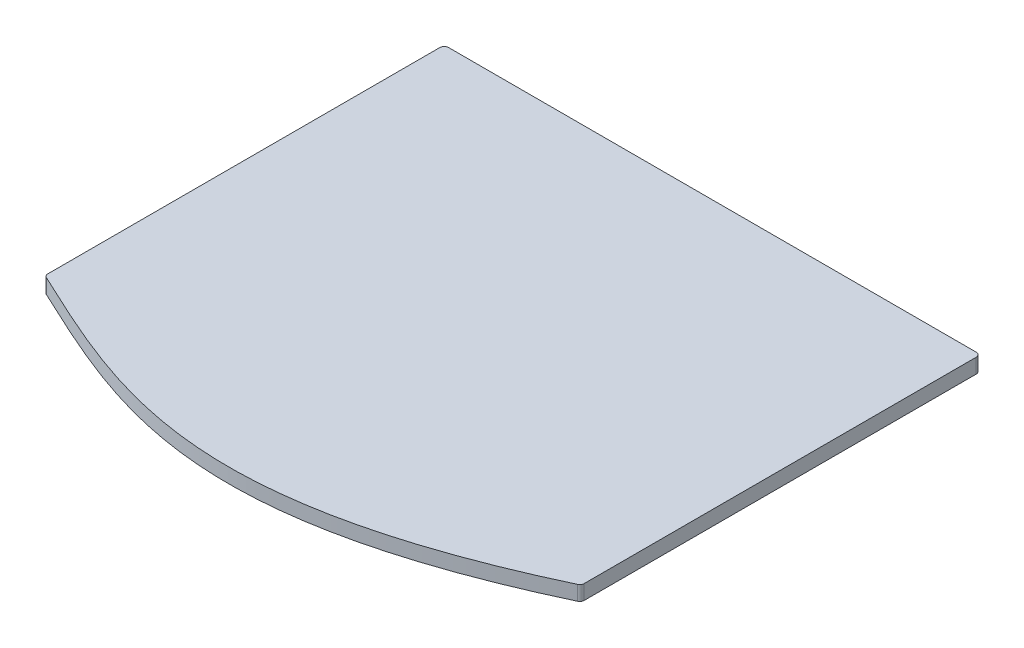
ISO-10303-21;
HEADER;
FILE_DESCRIPTION(('STEP AP214'),'2;1');
FILE_NAME('part.step','',(''),(''),'','','');
FILE_SCHEMA(('AUTOMOTIVE_DESIGN { 1 0 10303 214 1 1 1 1 }'));
ENDSEC;
DATA;
#1=APPLICATION_CONTEXT('core data for automotive mechanical design processes');
#2=APPLICATION_PROTOCOL_DEFINITION('international standard','automotive_design',2000,#1);
#3=PRODUCT_CONTEXT('',#1,'mechanical');
#4=PRODUCT('Part','Part','',(#3));
#5=PRODUCT_RELATED_PRODUCT_CATEGORY('part','',(#4));
#6=PRODUCT_DEFINITION_FORMATION('','',#4);
#7=PRODUCT_DEFINITION_CONTEXT('part definition',#1,'design');
#8=PRODUCT_DEFINITION('design','',#6,#7);
#9=PRODUCT_DEFINITION_SHAPE('','',#8);
#10=(LENGTH_UNIT() NAMED_UNIT(*) SI_UNIT(.MILLI.,.METRE.));
#11=(NAMED_UNIT(*) PLANE_ANGLE_UNIT() SI_UNIT($,.RADIAN.));
#12=(NAMED_UNIT(*) SI_UNIT($,.STERADIAN.) SOLID_ANGLE_UNIT());
#13=UNCERTAINTY_MEASURE_WITH_UNIT(LENGTH_MEASURE(1.E-05),#10,'distance_accuracy_value','');
#14=(GEOMETRIC_REPRESENTATION_CONTEXT(3) GLOBAL_UNCERTAINTY_ASSIGNED_CONTEXT((#13)) GLOBAL_UNIT_ASSIGNED_CONTEXT((#10,
#11,#12)) REPRESENTATION_CONTEXT('',''));
#15=CARTESIAN_POINT('',(0.,0.,0.));
#16=DIRECTION('',(0.,0.,1.));
#17=DIRECTION('',(1.,0.,0.));
#18=AXIS2_PLACEMENT_3D('',#15,#16,#17);
#19=CARTESIAN_POINT('',(-180.,10.,-130.));
#20=DIRECTION('',(0.,-1.,0.));
#21=DIRECTION('',(0.,0.,-1.));
#22=AXIS2_PLACEMENT_3D('',#19,#20,#21);
#23=CYLINDRICAL_SURFACE('',#22,2.99999999999979);
#24=CARTESIAN_POINT('',(-180.,0.,-130.));
#25=DIRECTION('',(0.,1.,0.));
#26=DIRECTION('',(0.,0.,1.));
#27=AXIS2_PLACEMENT_3D('',#24,#25,#26);
#28=CIRCLE('',#27,2.99999999999979);
#29=CARTESIAN_POINT('',(-180.,0.,-132.999999999999));
#30=VERTEX_POINT('',#29);
#31=CARTESIAN_POINT('',(-183.000000000001,0.,-129.999999999999));
#32=VERTEX_POINT('',#31);
#33=EDGE_CURVE('E147',#30,#32,#28,.T.);
#34=ORIENTED_EDGE('',*,*,#33,.T.);
#35=DIRECTION('',(0.,-1.,0.));
#36=VECTOR('',#35,1.);
#37=CARTESIAN_POINT('',(-183.000000000001,10.,-129.999999999999));
#38=LINE('',#37,#36);
#39=CARTESIAN_POINT('',(-183.000000000001,10.,-129.999999999999));
#40=VERTEX_POINT('',#39);
#41=EDGE_CURVE('E11',#40,#32,#38,.T.);
#42=ORIENTED_EDGE('',*,*,#41,.F.);
#43=CARTESIAN_POINT('',(-180.,10.,-130.));
#44=DIRECTION('',(0.,1.,0.));
#45=DIRECTION('',(0.,0.,1.));
#46=AXIS2_PLACEMENT_3D('',#43,#44,#45);
#47=CIRCLE('',#46,2.99999999999979);
#48=CARTESIAN_POINT('',(-180.,10.,-132.999999999999));
#49=VERTEX_POINT('',#48);
#50=EDGE_CURVE('E171',#49,#40,#47,.T.);
#51=ORIENTED_EDGE('',*,*,#50,.F.);
#52=DIRECTION('',(0.,-1.,0.));
#53=VECTOR('',#52,1.);
#54=CARTESIAN_POINT('',(-180.,10.,-132.999999999999));
#55=LINE('',#54,#53);
#56=EDGE_CURVE('E145',#49,#30,#55,.T.);
#57=ORIENTED_EDGE('',*,*,#56,.T.);
#58=EDGE_LOOP('',(#34,#42,#51,#57));
#59=FACE_BOUND('',#58,.T.);
#60=ADVANCED_FACE('F44',(#59),#23,.T.);
#61=CARTESIAN_POINT('',(-183.000000000001,10.,-129.999999999999));
#62=DIRECTION('',(1.,0.,0.));
#63=DIRECTION('',(0.,0.,-1.));
#64=AXIS2_PLACEMENT_3D('',#61,#62,#63);
#65=PLANE('',#64);
#66=DIRECTION('',(0.,0.,1.));
#67=VECTOR('',#66,1.);
#68=CARTESIAN_POINT('',(-183.000000000001,0.,-129.999999999999));
#69=LINE('',#68,#67);
#70=CARTESIAN_POINT('',(-182.999999999999,0.,137.480797285215));
#71=VERTEX_POINT('',#70);
#72=EDGE_CURVE('E148',#32,#71,#69,.T.);
#73=ORIENTED_EDGE('',*,*,#72,.T.);
#74=DIRECTION('',(0.,-1.,0.));
#75=VECTOR('',#74,1.);
#76=CARTESIAN_POINT('',(-182.999999999999,10.,137.480797285215));
#77=LINE('',#76,#75);
#78=CARTESIAN_POINT('',(-182.999999999999,10.,137.480797285215));
#79=VERTEX_POINT('',#78);
#80=EDGE_CURVE('E53',#79,#71,#77,.T.);
#81=ORIENTED_EDGE('',*,*,#80,.F.);
#82=DIRECTION('',(0.,0.,1.));
#83=VECTOR('',#82,1.);
#84=CARTESIAN_POINT('',(-183.000000000001,10.,-129.999999999999));
#85=LINE('',#84,#83);
#86=EDGE_CURVE('E103',#40,#79,#85,.T.);
#87=ORIENTED_EDGE('',*,*,#86,.F.);
#88=ORIENTED_EDGE('',*,*,#41,.T.);
#89=EDGE_LOOP('',(#73,#81,#87,#88));
#90=FACE_BOUND('',#89,.T.);
#91=ADVANCED_FACE('F222',(#90),#65,.F.);
#92=CARTESIAN_POINT('',(-180.,10.,137.480797285215));
#93=DIRECTION('',(0.,-1.,0.));
#94=DIRECTION('',(0.,0.,-1.));
#95=AXIS2_PLACEMENT_3D('',#92,#93,#94);
#96=CYLINDRICAL_SURFACE('',#95,2.99999999999987);
#97=CARTESIAN_POINT('',(-180.,0.,137.480797285215));
#98=DIRECTION('',(0.,1.,0.));
#99=DIRECTION('',(0.,0.,-1.));
#100=AXIS2_PLACEMENT_3D('',#97,#98,#99);
#101=CIRCLE('',#100,2.99999999999987);
#102=CARTESIAN_POINT('',(-181.279009587554,0.,140.194491165324));
#103=VERTEX_POINT('',#102);
#104=EDGE_CURVE('E154',#71,#103,#101,.T.);
#105=ORIENTED_EDGE('',*,*,#104,.T.);
#106=DIRECTION('',(0.,-1.,0.));
#107=VECTOR('',#106,1.);
#108=CARTESIAN_POINT('',(-181.279009587554,10.,140.194491165324));
#109=LINE('',#108,#107);
#110=CARTESIAN_POINT('',(-181.279009587554,10.,140.194491165324));
#111=VERTEX_POINT('',#110);
#112=EDGE_CURVE('E182',#111,#103,#109,.T.);
#113=ORIENTED_EDGE('',*,*,#112,.F.);
#114=CARTESIAN_POINT('',(-180.,10.,137.480797285215));
#115=DIRECTION('',(0.,1.,0.));
#116=DIRECTION('',(0.,0.,-1.));
#117=AXIS2_PLACEMENT_3D('',#114,#115,#116);
#118=CIRCLE('',#117,2.99999999999987);
#119=EDGE_CURVE('E191',#79,#111,#118,.T.);
#120=ORIENTED_EDGE('',*,*,#119,.F.);
#121=ORIENTED_EDGE('',*,*,#80,.T.);
#122=EDGE_LOOP('',(#105,#113,#120,#121));
#123=FACE_BOUND('',#122,.T.);
#124=ADVANCED_FACE('F195',(#123),#96,.T.);
#125=CARTESIAN_POINT('',(-181.279009587554,10.,140.194491165325));
#126=CARTESIAN_POINT('',(-178.340737072768,10.,141.579348442266));
#127=CARTESIAN_POINT('',(-172.45388843496,10.,144.353901137228));
#128=CARTESIAN_POINT('',(-160.745962638319,10.,149.828936180916));
#129=CARTESIAN_POINT('',(-146.131511081942,10.,156.502626260277));
#130=CARTESIAN_POINT('',(-128.508260206548,10.,164.046283741229));
#131=CARTESIAN_POINT('',(-104.702719280052,10.,173.254127298284));
#132=CARTESIAN_POINT('',(-74.0169596799951,10.,182.744139438629));
#133=CARTESIAN_POINT('',(-41.0443714758234,10.,188.463963895542));
#134=CARTESIAN_POINT('',(-12.5768108543959,10.,190.101586867692));
#135=CARTESIAN_POINT('',(10.0062302215642,10.,189.672423751283));
#136=CARTESIAN_POINT('',(34.0037537976909,10.,187.388029591299));
#137=CARTESIAN_POINT('',(59.589491456967,10.,183.039691820379));
#138=CARTESIAN_POINT('',(82.3694627972277,10.,177.517534007781));
#139=CARTESIAN_POINT('',(101.543699636903,10.,171.852795873202));
#140=CARTESIAN_POINT('',(116.417253832946,10.,166.953916140967));
#141=CARTESIAN_POINT('',(131.801190076497,10.,161.377995825418));
#142=CARTESIAN_POINT('',(145.060365153822,10.,156.145247632117));
#143=CARTESIAN_POINT('',(155.940082719494,10.,151.594001251932));
#144=CARTESIAN_POINT('',(164.236790757584,10.,147.995411699382));
#145=CARTESIAN_POINT('',(171.271002297292,10.,144.837475156607));
#146=CARTESIAN_POINT('',(176.961457618295,10.,142.218806841253));
#147=CARTESIAN_POINT('',(179.845058415146,10.,140.870336481201));
#148=CARTESIAN_POINT('',(181.279009587555,10.,140.194491165324));
#149=B_SPLINE_CURVE_WITH_KNOTS('',3,(#125,#126,#127,#128,#129,#130,#131,#132,#133,#134,#135,
#136,#137,#138,#139,#140,#141,#142,#143,#144,#145,#146,#147,#148),.UNSPECIFIED.,.F.,.F.,(4,1,1,
1,1,1,1,1,1,1,1,1,1,1,1,1,1,1,1,1,1,4),(0.,0.03125,0.0625,0.125,0.1875,0.25,0.375,0.5,0.5625,
0.625,0.6875,0.75,0.8125,0.84375,0.875,0.90625,0.9375,0.953125,0.96875,0.984375,0.9921875,1.),.UNSPECIFIED.);
#150=DIRECTION('',(0.,-1.,0.));
#151=VECTOR('',#150,1.);
#152=SURFACE_OF_LINEAR_EXTRUSION('',#149,#151);
#153=CARTESIAN_POINT('',(-181.279009587554,0.,140.194491165325));
#154=CARTESIAN_POINT('',(-178.340737072768,0.,141.579348442266));
#155=CARTESIAN_POINT('',(-172.45388843496,0.,144.353901137228));
#156=CARTESIAN_POINT('',(-160.745962638319,0.,149.828936180916));
#157=CARTESIAN_POINT('',(-146.131511081942,0.,156.502626260277));
#158=CARTESIAN_POINT('',(-128.508260206548,0.,164.046283741229));
#159=CARTESIAN_POINT('',(-104.702719280052,0.,173.254127298284));
#160=CARTESIAN_POINT('',(-74.0169596799951,0.,182.744139438629));
#161=CARTESIAN_POINT('',(-41.0443714758234,0.,188.463963895542));
#162=CARTESIAN_POINT('',(-12.5768108543959,0.,190.101586867692));
#163=CARTESIAN_POINT('',(10.0062302215642,0.,189.672423751283));
#164=CARTESIAN_POINT('',(34.0037537976909,0.,187.388029591299));
#165=CARTESIAN_POINT('',(59.589491456967,0.,183.039691820379));
#166=CARTESIAN_POINT('',(82.3694627972277,0.,177.517534007781));
#167=CARTESIAN_POINT('',(101.543699636903,0.,171.852795873202));
#168=CARTESIAN_POINT('',(116.417253832946,0.,166.953916140967));
#169=CARTESIAN_POINT('',(131.801190076497,0.,161.377995825418));
#170=CARTESIAN_POINT('',(145.060365153822,0.,156.145247632117));
#171=CARTESIAN_POINT('',(155.940082719494,0.,151.594001251932));
#172=CARTESIAN_POINT('',(164.236790757584,0.,147.995411699382));
#173=CARTESIAN_POINT('',(171.271002297292,0.,144.837475156607));
#174=CARTESIAN_POINT('',(176.961457618295,0.,142.218806841253));
#175=CARTESIAN_POINT('',(179.845058415146,0.,140.870336481201));
#176=CARTESIAN_POINT('',(181.279009587555,0.,140.194491165324));
#177=B_SPLINE_CURVE_WITH_KNOTS('',3,(#153,#154,#155,#156,#157,#158,#159,#160,#161,#162,#163,
#164,#165,#166,#167,#168,#169,#170,#171,#172,#173,#174,#175,#176),.UNSPECIFIED.,.F.,.F.,(4,1,1,
1,1,1,1,1,1,1,1,1,1,1,1,1,1,1,1,1,1,4),(0.,0.03125,0.0625,0.125,0.1875,0.25,0.375,0.5,0.5625,
0.625,0.6875,0.75,0.8125,0.84375,0.875,0.90625,0.9375,0.953125,0.96875,0.984375,0.9921875,1.),.UNSPECIFIED.);
#178=CARTESIAN_POINT('',(181.279009587555,0.,140.194491165324));
#179=VERTEX_POINT('',#178);
#180=EDGE_CURVE('E157',#103,#179,#177,.T.);
#181=ORIENTED_EDGE('',*,*,#180,.T.);
#182=DIRECTION('',(0.,-1.,0.));
#183=VECTOR('',#182,1.);
#184=CARTESIAN_POINT('',(181.279009587555,10.,140.194491165324));
#185=LINE('',#184,#183);
#186=CARTESIAN_POINT('',(181.279009587555,10.,140.194491165324));
#187=VERTEX_POINT('',#186);
#188=EDGE_CURVE('E179',#187,#179,#185,.T.);
#189=ORIENTED_EDGE('',*,*,#188,.F.);
#190=EDGE_CURVE('E207',#111,#187,#149,.T.);
#191=ORIENTED_EDGE('',*,*,#190,.F.);
#192=ORIENTED_EDGE('',*,*,#112,.T.);
#193=EDGE_LOOP('',(#181,#189,#191,#192));
#194=FACE_BOUND('',#193,.T.);
#195=ADVANCED_FACE('F205',(#194),#152,.F.);
#196=CARTESIAN_POINT('',(180.,10.,137.480797285215));
#197=DIRECTION('',(0.,-1.,0.));
#198=DIRECTION('',(0.,0.,-1.));
#199=AXIS2_PLACEMENT_3D('',#196,#197,#198);
#200=CYLINDRICAL_SURFACE('',#199,2.99999999999998);
#201=CARTESIAN_POINT('',(180.,0.,137.480797285215));
#202=DIRECTION('',(0.,1.,0.));
#203=DIRECTION('',(0.,0.,1.));
#204=AXIS2_PLACEMENT_3D('',#201,#202,#203);
#205=CIRCLE('',#204,2.99999999999998);
#206=CARTESIAN_POINT('',(183.,0.,137.480797285215));
#207=VERTEX_POINT('',#206);
#208=EDGE_CURVE('E161',#179,#207,#205,.T.);
#209=ORIENTED_EDGE('',*,*,#208,.T.);
#210=DIRECTION('',(0.,-1.,0.));
#211=VECTOR('',#210,1.);
#212=CARTESIAN_POINT('',(183.,10.,137.480797285215));
#213=LINE('',#212,#211);
#214=CARTESIAN_POINT('',(183.,10.,137.480797285215));
#215=VERTEX_POINT('',#214);
#216=EDGE_CURVE('E134',#215,#207,#213,.T.);
#217=ORIENTED_EDGE('',*,*,#216,.F.);
#218=CARTESIAN_POINT('',(180.,10.,137.480797285215));
#219=DIRECTION('',(0.,1.,0.));
#220=DIRECTION('',(0.,0.,1.));
#221=AXIS2_PLACEMENT_3D('',#218,#219,#220);
#222=CIRCLE('',#221,2.99999999999998);
#223=EDGE_CURVE('E125',#187,#215,#222,.T.);
#224=ORIENTED_EDGE('',*,*,#223,.F.);
#225=ORIENTED_EDGE('',*,*,#188,.T.);
#226=EDGE_LOOP('',(#209,#217,#224,#225));
#227=FACE_BOUND('',#226,.T.);
#228=ADVANCED_FACE('F203',(#227),#200,.T.);
#229=CARTESIAN_POINT('',(183.,10.,-130.));
#230=DIRECTION('',(-1.,0.,0.));
#231=DIRECTION('',(0.,0.,1.));
#232=AXIS2_PLACEMENT_3D('',#229,#230,#231);
#233=PLANE('',#232);
#234=DIRECTION('',(0.,0.,-1.));
#235=VECTOR('',#234,1.);
#236=CARTESIAN_POINT('',(183.,0.,-130.));
#237=LINE('',#236,#235);
#238=CARTESIAN_POINT('',(183.,0.,-130.));
#239=VERTEX_POINT('',#238);
#240=EDGE_CURVE('E133',#207,#239,#237,.T.);
#241=ORIENTED_EDGE('',*,*,#240,.T.);
#242=DIRECTION('',(0.,-1.,0.));
#243=VECTOR('',#242,1.);
#244=CARTESIAN_POINT('',(183.,10.,-130.));
#245=LINE('',#244,#243);
#246=CARTESIAN_POINT('',(183.,10.,-130.));
#247=VERTEX_POINT('',#246);
#248=EDGE_CURVE('E127',#247,#239,#245,.T.);
#249=ORIENTED_EDGE('',*,*,#248,.F.);
#250=DIRECTION('',(0.,0.,-1.));
#251=VECTOR('',#250,1.);
#252=CARTESIAN_POINT('',(183.,10.,-130.));
#253=LINE('',#252,#251);
#254=EDGE_CURVE('E119',#215,#247,#253,.T.);
#255=ORIENTED_EDGE('',*,*,#254,.F.);
#256=ORIENTED_EDGE('',*,*,#216,.T.);
#257=EDGE_LOOP('',(#241,#249,#255,#256));
#258=FACE_BOUND('',#257,.T.);
#259=ADVANCED_FACE('F131',(#258),#233,.F.);
#260=CARTESIAN_POINT('',(180.,10.,-130.));
#261=DIRECTION('',(0.,-1.,0.));
#262=DIRECTION('',(0.,0.,-1.));
#263=AXIS2_PLACEMENT_3D('',#260,#261,#262);
#264=CYLINDRICAL_SURFACE('',#263,3.00000000000035);
#265=CARTESIAN_POINT('',(180.,0.,-130.));
#266=DIRECTION('',(0.,1.,0.));
#267=DIRECTION('',(0.,0.,1.));
#268=AXIS2_PLACEMENT_3D('',#265,#266,#267);
#269=CIRCLE('',#268,3.00000000000035);
#270=CARTESIAN_POINT('',(179.999999999999,0.,-133.));
#271=VERTEX_POINT('',#270);
#272=EDGE_CURVE('E91',#239,#271,#269,.T.);
#273=ORIENTED_EDGE('',*,*,#272,.T.);
#274=DIRECTION('',(0.,-1.,0.));
#275=VECTOR('',#274,1.);
#276=CARTESIAN_POINT('',(179.999999999999,10.,-133.));
#277=LINE('',#276,#275);
#278=CARTESIAN_POINT('',(179.999999999999,10.,-133.));
#279=VERTEX_POINT('',#278);
#280=EDGE_CURVE('E136',#279,#271,#277,.T.);
#281=ORIENTED_EDGE('',*,*,#280,.F.);
#282=CARTESIAN_POINT('',(180.,10.,-130.));
#283=DIRECTION('',(0.,1.,0.));
#284=DIRECTION('',(0.,0.,1.));
#285=AXIS2_PLACEMENT_3D('',#282,#283,#284);
#286=CIRCLE('',#285,3.00000000000035);
#287=EDGE_CURVE('E122',#247,#279,#286,.T.);
#288=ORIENTED_EDGE('',*,*,#287,.F.);
#289=ORIENTED_EDGE('',*,*,#248,.T.);
#290=EDGE_LOOP('',(#273,#281,#288,#289));
#291=FACE_BOUND('',#290,.T.);
#292=ADVANCED_FACE('F138',(#291),#264,.T.);
#293=CARTESIAN_POINT('',(-180.,10.,-132.999999999999));
#294=DIRECTION('',(0.,0.,1.));
#295=DIRECTION('',(1.,0.,0.));
#296=AXIS2_PLACEMENT_3D('',#293,#294,#295);
#297=PLANE('',#296);
#298=DIRECTION('',(-1.,0.,0.));
#299=VECTOR('',#298,1.);
#300=CARTESIAN_POINT('',(-180.,0.,-132.999999999999));
#301=LINE('',#300,#299);
#302=EDGE_CURVE('E100',#271,#30,#301,.T.);
#303=ORIENTED_EDGE('',*,*,#302,.T.);
#304=ORIENTED_EDGE('',*,*,#56,.F.);
#305=DIRECTION('',(-1.,0.,0.));
#306=VECTOR('',#305,1.);
#307=CARTESIAN_POINT('',(-180.,10.,-132.999999999999));
#308=LINE('',#307,#306);
#309=EDGE_CURVE('E62',#279,#49,#308,.T.);
#310=ORIENTED_EDGE('',*,*,#309,.F.);
#311=ORIENTED_EDGE('',*,*,#280,.T.);
#312=EDGE_LOOP('',(#303,#304,#310,#311));
#313=FACE_BOUND('',#312,.T.);
#314=ADVANCED_FACE('F235',(#313),#297,.F.);
#315=CARTESIAN_POINT('',(-180.,10.,-130.));
#316=DIRECTION('',(0.,1.,0.));
#317=DIRECTION('',(0.,0.,1.));
#318=AXIS2_PLACEMENT_3D('',#315,#316,#317);
#319=PLANE('',#318);
#320=ORIENTED_EDGE('',*,*,#50,.T.);
#321=ORIENTED_EDGE('',*,*,#86,.T.);
#322=ORIENTED_EDGE('',*,*,#119,.T.);
#323=ORIENTED_EDGE('',*,*,#190,.T.);
#324=ORIENTED_EDGE('',*,*,#223,.T.);
#325=ORIENTED_EDGE('',*,*,#254,.T.);
#326=ORIENTED_EDGE('',*,*,#287,.T.);
#327=ORIENTED_EDGE('',*,*,#309,.T.);
#328=EDGE_LOOP('',(#320,#321,#322,#323,#324,#325,#326,#327));
#329=FACE_BOUND('',#328,.T.);
#330=ADVANCED_FACE('F120',(#329),#319,.T.);
#331=CARTESIAN_POINT('',(-180.,0.,-130.));
#332=DIRECTION('',(0.,1.,0.));
#333=DIRECTION('',(0.,0.,1.));
#334=AXIS2_PLACEMENT_3D('',#331,#332,#333);
#335=PLANE('',#334);
#336=ORIENTED_EDGE('',*,*,#33,.F.);
#337=ORIENTED_EDGE('',*,*,#302,.F.);
#338=ORIENTED_EDGE('',*,*,#272,.F.);
#339=ORIENTED_EDGE('',*,*,#240,.F.);
#340=ORIENTED_EDGE('',*,*,#208,.F.);
#341=ORIENTED_EDGE('',*,*,#180,.F.);
#342=ORIENTED_EDGE('',*,*,#104,.F.);
#343=ORIENTED_EDGE('',*,*,#72,.F.);
#344=EDGE_LOOP('',(#336,#337,#338,#339,#340,#341,#342,#343));
#345=FACE_BOUND('',#344,.T.);
#346=ADVANCED_FACE('F199',(#345),#335,.F.);
#347=CLOSED_SHELL('',(#60,#91,#124,#195,#228,#259,#292,#314,#330,#346));
#348=MANIFOLD_SOLID_BREP('B2',#347);
#349=ADVANCED_BREP_SHAPE_REPRESENTATION('',(#18,#348),#14);
#350=SHAPE_DEFINITION_REPRESENTATION(#9,#349);
ENDSEC;
END-ISO-10303-21;
